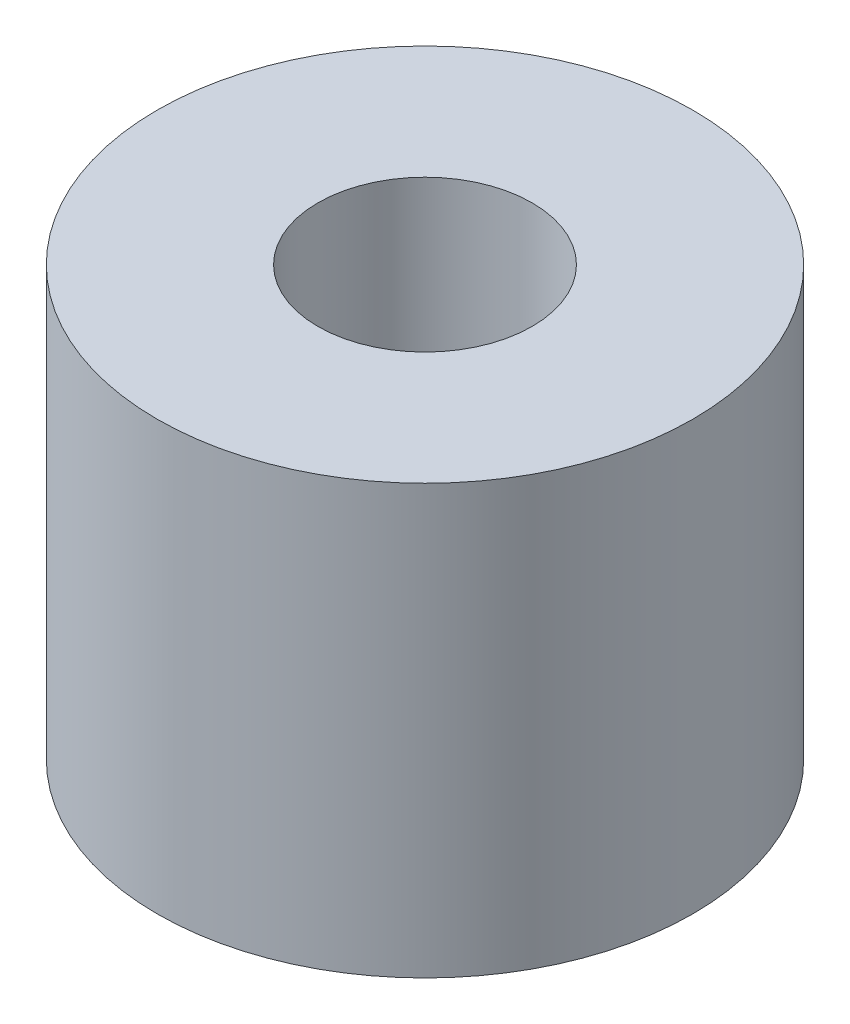
ISO-10303-21;
HEADER;
FILE_DESCRIPTION(('STEP AP214'),'2;1');
FILE_NAME('part.step','',(''),(''),'','','');
FILE_SCHEMA(('AUTOMOTIVE_DESIGN { 1 0 10303 214 1 1 1 1 }'));
ENDSEC;
DATA;
#1=APPLICATION_CONTEXT('core data for automotive mechanical design processes');
#2=APPLICATION_PROTOCOL_DEFINITION('international standard','automotive_design',2000,#1);
#3=PRODUCT_CONTEXT('',#1,'mechanical');
#4=PRODUCT('Part','Part','',(#3));
#5=PRODUCT_RELATED_PRODUCT_CATEGORY('part','',(#4));
#6=PRODUCT_DEFINITION_FORMATION('','',#4);
#7=PRODUCT_DEFINITION_CONTEXT('part definition',#1,'design');
#8=PRODUCT_DEFINITION('design','',#6,#7);
#9=PRODUCT_DEFINITION_SHAPE('','',#8);
#10=(LENGTH_UNIT() NAMED_UNIT(*) SI_UNIT(.MILLI.,.METRE.));
#11=(NAMED_UNIT(*) PLANE_ANGLE_UNIT() SI_UNIT($,.RADIAN.));
#12=(NAMED_UNIT(*) SI_UNIT($,.STERADIAN.) SOLID_ANGLE_UNIT());
#13=UNCERTAINTY_MEASURE_WITH_UNIT(LENGTH_MEASURE(1.E-05),#10,'distance_accuracy_value','');
#14=(GEOMETRIC_REPRESENTATION_CONTEXT(3) GLOBAL_UNCERTAINTY_ASSIGNED_CONTEXT((#13)) GLOBAL_UNIT_ASSIGNED_CONTEXT((#10,
#11,#12)) REPRESENTATION_CONTEXT('',''));
#15=CARTESIAN_POINT('',(0.,0.,0.));
#16=DIRECTION('',(0.,0.,1.));
#17=DIRECTION('',(1.,0.,0.));
#18=AXIS2_PLACEMENT_3D('',#15,#16,#17);
#19=CARTESIAN_POINT('',(0.,8.,0.));
#20=DIRECTION('',(0.,1.,0.));
#21=DIRECTION('',(0.,0.,1.));
#22=AXIS2_PLACEMENT_3D('',#19,#20,#21);
#23=PLANE('',#22);
#24=CARTESIAN_POINT('',(0.,8.,0.));
#25=DIRECTION('',(0.,1.,0.));
#26=DIRECTION('',(0.,0.,1.));
#27=AXIS2_PLACEMENT_3D('',#24,#25,#26);
#28=CIRCLE('',#27,5.);
#29=CARTESIAN_POINT('',(0.,8.,5.));
#30=VERTEX_POINT('',#29);
#31=EDGE_CURVE('E10',#30,#30,#28,.T.);
#32=ORIENTED_EDGE('',*,*,#31,.T.);
#33=EDGE_LOOP('',(#32));
#34=FACE_BOUND('',#33,.T.);
#35=CARTESIAN_POINT('',(0.,8.,0.));
#36=DIRECTION('',(0.,1.,0.));
#37=DIRECTION('',(0.,0.,1.));
#38=AXIS2_PLACEMENT_3D('',#35,#36,#37);
#39=CIRCLE('',#38,2.);
#40=CARTESIAN_POINT('',(0.,8.,2.));
#41=VERTEX_POINT('',#40);
#42=EDGE_CURVE('E50',#41,#41,#39,.T.);
#43=ORIENTED_EDGE('',*,*,#42,.F.);
#44=EDGE_LOOP('',(#43));
#45=FACE_BOUND('',#44,.T.);
#46=ADVANCED_FACE('F37',(#34,#45),#23,.T.);
#47=CARTESIAN_POINT('',(0.,0.,0.));
#48=DIRECTION('',(0.,1.,0.));
#49=DIRECTION('',(0.,0.,1.));
#50=AXIS2_PLACEMENT_3D('',#47,#48,#49);
#51=PLANE('',#50);
#52=CARTESIAN_POINT('',(0.,0.,0.));
#53=DIRECTION('',(0.,1.,0.));
#54=DIRECTION('',(0.,0.,1.));
#55=AXIS2_PLACEMENT_3D('',#52,#53,#54);
#56=CIRCLE('',#55,5.);
#57=CARTESIAN_POINT('',(0.,0.,5.));
#58=VERTEX_POINT('',#57);
#59=EDGE_CURVE('E41',#58,#58,#56,.T.);
#60=ORIENTED_EDGE('',*,*,#59,.F.);
#61=EDGE_LOOP('',(#60));
#62=FACE_BOUND('',#61,.T.);
#63=CARTESIAN_POINT('',(0.,0.,0.));
#64=DIRECTION('',(0.,1.,0.));
#65=DIRECTION('',(0.,0.,1.));
#66=AXIS2_PLACEMENT_3D('',#63,#64,#65);
#67=CIRCLE('',#66,2.);
#68=CARTESIAN_POINT('',(0.,0.,2.));
#69=VERTEX_POINT('',#68);
#70=EDGE_CURVE('E52',#69,#69,#67,.T.);
#71=ORIENTED_EDGE('',*,*,#70,.T.);
#72=EDGE_LOOP('',(#71));
#73=FACE_BOUND('',#72,.T.);
#74=ADVANCED_FACE('F64',(#62,#73),#51,.F.);
#75=CARTESIAN_POINT('',(0.,8.,0.));
#76=DIRECTION('',(0.,-1.,0.));
#77=DIRECTION('',(0.,0.,-1.));
#78=AXIS2_PLACEMENT_3D('',#75,#76,#77);
#79=CYLINDRICAL_SURFACE('',#78,5.);
#80=ORIENTED_EDGE('',*,*,#31,.F.);
#81=EDGE_LOOP('',(#80));
#82=FACE_BOUND('',#81,.T.);
#83=ORIENTED_EDGE('',*,*,#59,.T.);
#84=EDGE_LOOP('',(#83));
#85=FACE_BOUND('',#84,.T.);
#86=ADVANCED_FACE('F39',(#82,#85),#79,.T.);
#87=CARTESIAN_POINT('',(0.,8.,0.));
#88=DIRECTION('',(0.,-1.,0.));
#89=DIRECTION('',(0.,0.,-1.));
#90=AXIS2_PLACEMENT_3D('',#87,#88,#89);
#91=CYLINDRICAL_SURFACE('',#90,2.);
#92=ORIENTED_EDGE('',*,*,#42,.T.);
#93=EDGE_LOOP('',(#92));
#94=FACE_BOUND('',#93,.T.);
#95=ORIENTED_EDGE('',*,*,#70,.F.);
#96=EDGE_LOOP('',(#95));
#97=FACE_BOUND('',#96,.T.);
#98=ADVANCED_FACE('F60',(#94,#97),#91,.F.);
#99=CLOSED_SHELL('',(#46,#74,#86,#98));
#100=MANIFOLD_SOLID_BREP('B2',#99);
#101=ADVANCED_BREP_SHAPE_REPRESENTATION('',(#18,#100),#14);
#102=SHAPE_DEFINITION_REPRESENTATION(#9,#101);
ENDSEC;
END-ISO-10303-21;
